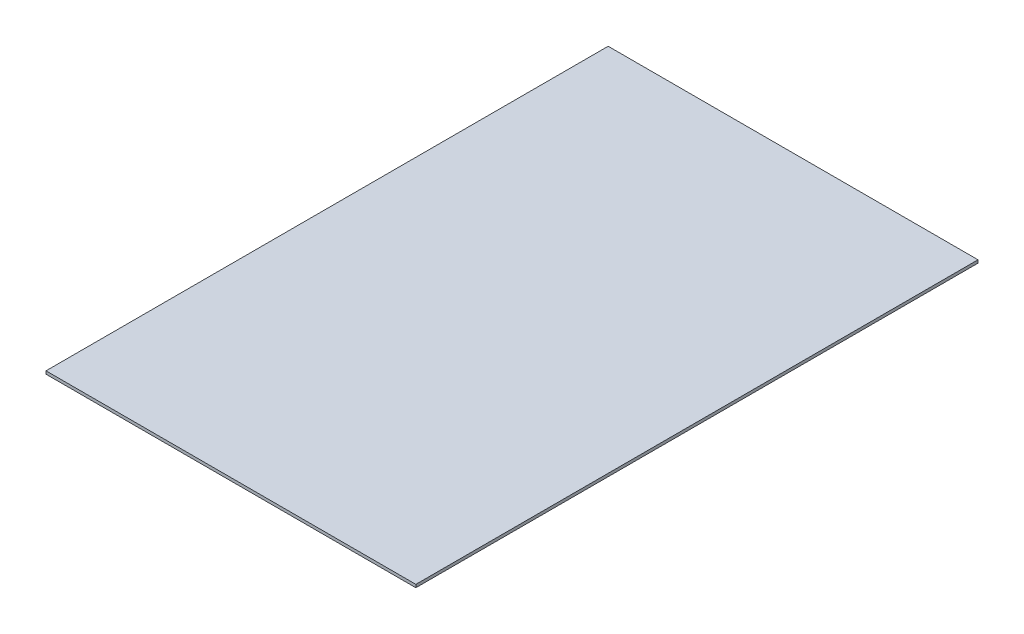
ISO-10303-21;
HEADER;
FILE_DESCRIPTION(('STEP AP214'),'2;1');
FILE_NAME('part.step','',(''),(''),'','','');
FILE_SCHEMA(('AUTOMOTIVE_DESIGN { 1 0 10303 214 1 1 1 1 }'));
ENDSEC;
DATA;
#1=APPLICATION_CONTEXT('core data for automotive mechanical design processes');
#2=APPLICATION_PROTOCOL_DEFINITION('international standard','automotive_design',2000,#1);
#3=PRODUCT_CONTEXT('',#1,'mechanical');
#4=PRODUCT('Part','Part','',(#3));
#5=PRODUCT_RELATED_PRODUCT_CATEGORY('part','',(#4));
#6=PRODUCT_DEFINITION_FORMATION('','',#4);
#7=PRODUCT_DEFINITION_CONTEXT('part definition',#1,'design');
#8=PRODUCT_DEFINITION('design','',#6,#7);
#9=PRODUCT_DEFINITION_SHAPE('','',#8);
#10=(LENGTH_UNIT() NAMED_UNIT(*) SI_UNIT(.MILLI.,.METRE.));
#11=(NAMED_UNIT(*) PLANE_ANGLE_UNIT() SI_UNIT($,.RADIAN.));
#12=(NAMED_UNIT(*) SI_UNIT($,.STERADIAN.) SOLID_ANGLE_UNIT());
#13=UNCERTAINTY_MEASURE_WITH_UNIT(LENGTH_MEASURE(1.E-05),#10,'distance_accuracy_value','');
#14=(GEOMETRIC_REPRESENTATION_CONTEXT(3) GLOBAL_UNCERTAINTY_ASSIGNED_CONTEXT((#13)) GLOBAL_UNIT_ASSIGNED_CONTEXT((#10,
#11,#12)) REPRESENTATION_CONTEXT('',''));
#15=CARTESIAN_POINT('',(0.,0.,0.));
#16=DIRECTION('',(0.,0.,1.));
#17=DIRECTION('',(1.,0.,0.));
#18=AXIS2_PLACEMENT_3D('',#15,#16,#17);
#19=CARTESIAN_POINT('',(158.75,2.54,241.3));
#20=DIRECTION('',(-1.,0.,0.));
#21=DIRECTION('',(0.,0.,1.));
#22=AXIS2_PLACEMENT_3D('',#19,#20,#21);
#23=PLANE('',#22);
#24=DIRECTION('',(0.,0.,-1.));
#25=VECTOR('',#24,1.);
#26=CARTESIAN_POINT('',(158.75,0.,241.3));
#27=LINE('',#26,#25);
#28=CARTESIAN_POINT('',(158.75,0.,241.3));
#29=VERTEX_POINT('',#28);
#30=CARTESIAN_POINT('',(158.75,0.,-241.3));
#31=VERTEX_POINT('',#30);
#32=EDGE_CURVE('E113',#29,#31,#27,.T.);
#33=ORIENTED_EDGE('',*,*,#32,.T.);
#34=DIRECTION('',(0.,-1.,0.));
#35=VECTOR('',#34,1.);
#36=CARTESIAN_POINT('',(158.75,2.54,-241.3));
#37=LINE('',#36,#35);
#38=CARTESIAN_POINT('',(158.75,2.54,-241.3));
#39=VERTEX_POINT('',#38);
#40=EDGE_CURVE('E11',#39,#31,#37,.T.);
#41=ORIENTED_EDGE('',*,*,#40,.F.);
#42=DIRECTION('',(0.,0.,-1.));
#43=VECTOR('',#42,1.);
#44=CARTESIAN_POINT('',(158.75,2.54,241.3));
#45=LINE('',#44,#43);
#46=CARTESIAN_POINT('',(158.75,2.54,241.3));
#47=VERTEX_POINT('',#46);
#48=EDGE_CURVE('E97',#47,#39,#45,.T.);
#49=ORIENTED_EDGE('',*,*,#48,.F.);
#50=DIRECTION('',(0.,-1.,0.));
#51=VECTOR('',#50,1.);
#52=CARTESIAN_POINT('',(158.75,2.54,241.3));
#53=LINE('',#52,#51);
#54=EDGE_CURVE('E109',#47,#29,#53,.T.);
#55=ORIENTED_EDGE('',*,*,#54,.T.);
#56=EDGE_LOOP('',(#33,#41,#49,#55));
#57=FACE_BOUND('',#56,.T.);
#58=ADVANCED_FACE('F45',(#57),#23,.F.);
#59=CARTESIAN_POINT('',(-158.75,2.54,-241.3));
#60=DIRECTION('',(0.,0.,1.));
#61=DIRECTION('',(1.,0.,0.));
#62=AXIS2_PLACEMENT_3D('',#59,#60,#61);
#63=PLANE('',#62);
#64=DIRECTION('',(-1.,0.,0.));
#65=VECTOR('',#64,1.);
#66=CARTESIAN_POINT('',(-158.75,0.,-241.3));
#67=LINE('',#66,#65);
#68=CARTESIAN_POINT('',(-158.75,0.,-241.3));
#69=VERTEX_POINT('',#68);
#70=EDGE_CURVE('E102',#31,#69,#67,.T.);
#71=ORIENTED_EDGE('',*,*,#70,.T.);
#72=DIRECTION('',(0.,-1.,0.));
#73=VECTOR('',#72,1.);
#74=CARTESIAN_POINT('',(-158.75,2.54,-241.3));
#75=LINE('',#74,#73);
#76=CARTESIAN_POINT('',(-158.75,2.54,-241.3));
#77=VERTEX_POINT('',#76);
#78=EDGE_CURVE('E54',#77,#69,#75,.T.);
#79=ORIENTED_EDGE('',*,*,#78,.F.);
#80=DIRECTION('',(-1.,0.,0.));
#81=VECTOR('',#80,1.);
#82=CARTESIAN_POINT('',(-158.75,2.54,-241.3));
#83=LINE('',#82,#81);
#84=EDGE_CURVE('E92',#39,#77,#83,.T.);
#85=ORIENTED_EDGE('',*,*,#84,.F.);
#86=ORIENTED_EDGE('',*,*,#40,.T.);
#87=EDGE_LOOP('',(#71,#79,#85,#86));
#88=FACE_BOUND('',#87,.T.);
#89=ADVANCED_FACE('F101',(#88),#63,.F.);
#90=CARTESIAN_POINT('',(-158.75,2.54,241.3));
#91=DIRECTION('',(1.,0.,0.));
#92=DIRECTION('',(0.,0.,-1.));
#93=AXIS2_PLACEMENT_3D('',#90,#91,#92);
#94=PLANE('',#93);
#95=DIRECTION('',(0.,0.,1.));
#96=VECTOR('',#95,1.);
#97=CARTESIAN_POINT('',(-158.75,0.,241.3));
#98=LINE('',#97,#96);
#99=CARTESIAN_POINT('',(-158.75,0.,241.3));
#100=VERTEX_POINT('',#99);
#101=EDGE_CURVE('E79',#69,#100,#98,.T.);
#102=ORIENTED_EDGE('',*,*,#101,.T.);
#103=DIRECTION('',(0.,-1.,0.));
#104=VECTOR('',#103,1.);
#105=CARTESIAN_POINT('',(-158.75,2.54,241.3));
#106=LINE('',#105,#104);
#107=CARTESIAN_POINT('',(-158.75,2.54,241.3));
#108=VERTEX_POINT('',#107);
#109=EDGE_CURVE('E104',#108,#100,#106,.T.);
#110=ORIENTED_EDGE('',*,*,#109,.F.);
#111=DIRECTION('',(0.,0.,1.));
#112=VECTOR('',#111,1.);
#113=CARTESIAN_POINT('',(-158.75,2.54,241.3));
#114=LINE('',#113,#112);
#115=EDGE_CURVE('E95',#77,#108,#114,.T.);
#116=ORIENTED_EDGE('',*,*,#115,.F.);
#117=ORIENTED_EDGE('',*,*,#78,.T.);
#118=EDGE_LOOP('',(#102,#110,#116,#117));
#119=FACE_BOUND('',#118,.T.);
#120=ADVANCED_FACE('F105',(#119),#94,.F.);
#121=CARTESIAN_POINT('',(-158.75,2.54,241.3));
#122=DIRECTION('',(0.,0.,-1.));
#123=DIRECTION('',(-1.,0.,0.));
#124=AXIS2_PLACEMENT_3D('',#121,#122,#123);
#125=PLANE('',#124);
#126=DIRECTION('',(1.,0.,0.));
#127=VECTOR('',#126,1.);
#128=CARTESIAN_POINT('',(-158.75,0.,241.3));
#129=LINE('',#128,#127);
#130=EDGE_CURVE('E85',#100,#29,#129,.T.);
#131=ORIENTED_EDGE('',*,*,#130,.T.);
#132=ORIENTED_EDGE('',*,*,#54,.F.);
#133=DIRECTION('',(1.,0.,0.));
#134=VECTOR('',#133,1.);
#135=CARTESIAN_POINT('',(-158.75,2.54,241.3));
#136=LINE('',#135,#134);
#137=EDGE_CURVE('E62',#108,#47,#136,.T.);
#138=ORIENTED_EDGE('',*,*,#137,.F.);
#139=ORIENTED_EDGE('',*,*,#109,.T.);
#140=EDGE_LOOP('',(#131,#132,#138,#139));
#141=FACE_BOUND('',#140,.T.);
#142=ADVANCED_FACE('F126',(#141),#125,.F.);
#143=CARTESIAN_POINT('',(0.,2.54,0.));
#144=DIRECTION('',(0.,-1.,0.));
#145=DIRECTION('',(0.,0.,-1.));
#146=AXIS2_PLACEMENT_3D('',#143,#144,#145);
#147=PLANE('',#146);
#148=ORIENTED_EDGE('',*,*,#48,.T.);
#149=ORIENTED_EDGE('',*,*,#84,.T.);
#150=ORIENTED_EDGE('',*,*,#115,.T.);
#151=ORIENTED_EDGE('',*,*,#137,.T.);
#152=EDGE_LOOP('',(#148,#149,#150,#151));
#153=FACE_BOUND('',#152,.T.);
#154=ADVANCED_FACE('F93',(#153),#147,.F.);
#155=CARTESIAN_POINT('',(0.,0.,0.));
#156=DIRECTION('',(0.,-1.,0.));
#157=DIRECTION('',(0.,0.,-1.));
#158=AXIS2_PLACEMENT_3D('',#155,#156,#157);
#159=PLANE('',#158);
#160=ORIENTED_EDGE('',*,*,#32,.F.);
#161=ORIENTED_EDGE('',*,*,#130,.F.);
#162=ORIENTED_EDGE('',*,*,#101,.F.);
#163=ORIENTED_EDGE('',*,*,#70,.F.);
#164=EDGE_LOOP('',(#160,#161,#162,#163));
#165=FACE_BOUND('',#164,.T.);
#166=ADVANCED_FACE('F129',(#165),#159,.T.);
#167=CLOSED_SHELL('',(#58,#89,#120,#142,#154,#166));
#168=MANIFOLD_SOLID_BREP('B2',#167);
#169=ADVANCED_BREP_SHAPE_REPRESENTATION('',(#18,#168),#14);
#170=SHAPE_DEFINITION_REPRESENTATION(#9,#169);
ENDSEC;
END-ISO-10303-21;
